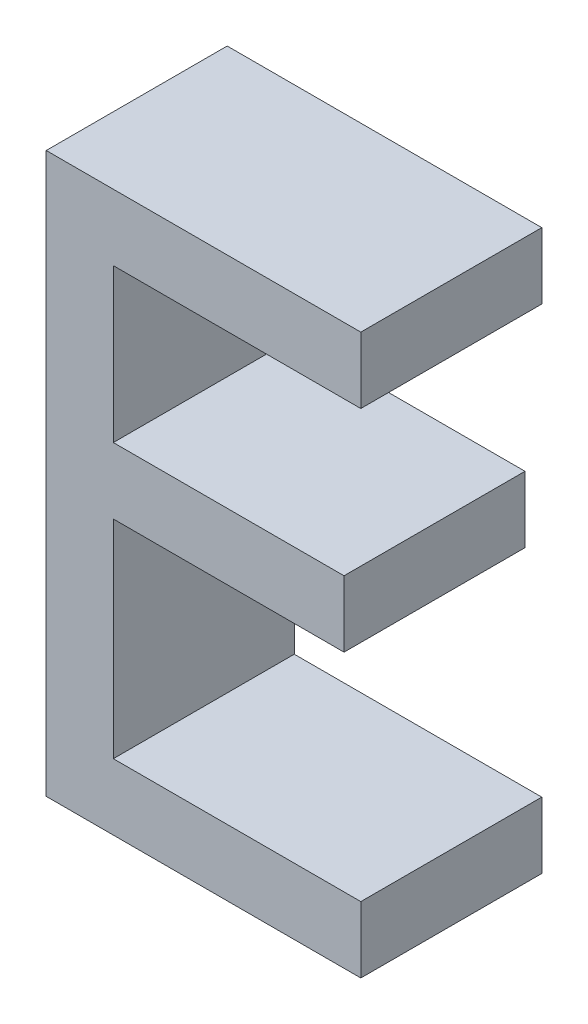
ISO-10303-21;
HEADER;
FILE_DESCRIPTION(('STEP AP214'),'2;1');
FILE_NAME('part.step','',(''),(''),'','','');
FILE_SCHEMA(('AUTOMOTIVE_DESIGN { 1 0 10303 214 1 1 1 1 }'));
ENDSEC;
DATA;
#1=APPLICATION_CONTEXT('core data for automotive mechanical design processes');
#2=APPLICATION_PROTOCOL_DEFINITION('international standard','automotive_design',2000,#1);
#3=PRODUCT_CONTEXT('',#1,'mechanical');
#4=PRODUCT('Part','Part','',(#3));
#5=PRODUCT_RELATED_PRODUCT_CATEGORY('part','',(#4));
#6=PRODUCT_DEFINITION_FORMATION('','',#4);
#7=PRODUCT_DEFINITION_CONTEXT('part definition',#1,'design');
#8=PRODUCT_DEFINITION('design','',#6,#7);
#9=PRODUCT_DEFINITION_SHAPE('','',#8);
#10=(LENGTH_UNIT() NAMED_UNIT(*) SI_UNIT(.MILLI.,.METRE.));
#11=(NAMED_UNIT(*) PLANE_ANGLE_UNIT() SI_UNIT($,.RADIAN.));
#12=(NAMED_UNIT(*) SI_UNIT($,.STERADIAN.) SOLID_ANGLE_UNIT());
#13=UNCERTAINTY_MEASURE_WITH_UNIT(LENGTH_MEASURE(1.E-05),#10,'distance_accuracy_value','');
#14=(GEOMETRIC_REPRESENTATION_CONTEXT(3) GLOBAL_UNCERTAINTY_ASSIGNED_CONTEXT((#13)) GLOBAL_UNIT_ASSIGNED_CONTEXT((#10,
#11,#12)) REPRESENTATION_CONTEXT('',''));
#15=CARTESIAN_POINT('',(0.,0.,0.));
#16=DIRECTION('',(0.,0.,1.));
#17=DIRECTION('',(1.,0.,0.));
#18=AXIS2_PLACEMENT_3D('',#15,#16,#17);
#19=CARTESIAN_POINT('',(-2.852208443237,0.498530555112812,0.));
#20=DIRECTION('',(0.,1.,0.));
#21=DIRECTION('',(-1.,0.,0.));
#22=AXIS2_PLACEMENT_3D('',#19,#20,#21);
#23=PLANE('',#22);
#24=DIRECTION('',(1.,0.,0.));
#25=VECTOR('',#24,1.);
#26=CARTESIAN_POINT('',(-3.026047706348,0.498530555112812,0.));
#27=LINE('',#26,#25);
#28=CARTESIAN_POINT('',(-3.026047706348,0.498530555112812,0.));
#29=VERTEX_POINT('',#28);
#30=CARTESIAN_POINT('',(-2.852208443237,0.498530555112812,0.));
#31=VERTEX_POINT('',#30);
#32=EDGE_CURVE('E11',#29,#31,#27,.T.);
#33=ORIENTED_EDGE('',*,*,#32,.F.);
#34=DIRECTION('',(0.,0.,1.));
#35=VECTOR('',#34,1.);
#36=CARTESIAN_POINT('',(-3.026047706348,0.498530555112812,0.));
#37=LINE('',#36,#35);
#38=CARTESIAN_POINT('',(-3.026047706348,0.498530555112812,0.1));
#39=VERTEX_POINT('',#38);
#40=EDGE_CURVE('E24',#29,#39,#37,.T.);
#41=ORIENTED_EDGE('',*,*,#40,.T.);
#42=DIRECTION('',(-1.,0.,0.));
#43=VECTOR('',#42,1.);
#44=CARTESIAN_POINT('',(-3.026047706348,0.498530555112812,0.1));
#45=LINE('',#44,#43);
#46=CARTESIAN_POINT('',(-2.852208443237,0.498530555112812,0.1));
#47=VERTEX_POINT('',#46);
#48=EDGE_CURVE('E124',#47,#39,#45,.T.);
#49=ORIENTED_EDGE('',*,*,#48,.F.);
#50=DIRECTION('',(0.,0.,1.));
#51=VECTOR('',#50,1.);
#52=CARTESIAN_POINT('',(-2.852208443237,0.498530555112812,0.));
#53=LINE('',#52,#51);
#54=EDGE_CURVE('E197',#31,#47,#53,.T.);
#55=ORIENTED_EDGE('',*,*,#54,.F.);
#56=EDGE_LOOP('',(#33,#41,#49,#55));
#57=FACE_BOUND('',#56,.T.);
#58=ADVANCED_FACE('F17',(#57),#23,.T.);
#59=CARTESIAN_POINT('',(-2.852208443237,0.461959182758085,0.));
#60=DIRECTION('',(1.,0.,0.));
#61=DIRECTION('',(0.,1.,0.));
#62=AXIS2_PLACEMENT_3D('',#59,#60,#61);
#63=PLANE('',#62);
#64=DIRECTION('',(0.,-1.,0.));
#65=VECTOR('',#64,1.);
#66=CARTESIAN_POINT('',(-2.852208443237,0.498530555112812,0.));
#67=LINE('',#66,#65);
#68=CARTESIAN_POINT('',(-2.852208443237,0.461959182758085,0.));
#69=VERTEX_POINT('',#68);
#70=EDGE_CURVE('E195',#31,#69,#67,.T.);
#71=ORIENTED_EDGE('',*,*,#70,.F.);
#72=ORIENTED_EDGE('',*,*,#54,.T.);
#73=DIRECTION('',(0.,1.,0.));
#74=VECTOR('',#73,1.);
#75=CARTESIAN_POINT('',(-2.852208443237,0.498530555112812,0.1));
#76=LINE('',#75,#74);
#77=CARTESIAN_POINT('',(-2.852208443237,0.461959182758085,0.1));
#78=VERTEX_POINT('',#77);
#79=EDGE_CURVE('E193',#78,#47,#76,.T.);
#80=ORIENTED_EDGE('',*,*,#79,.F.);
#81=DIRECTION('',(0.,0.,1.));
#82=VECTOR('',#81,1.);
#83=CARTESIAN_POINT('',(-2.852208443237,0.461959182758085,0.));
#84=LINE('',#83,#82);
#85=EDGE_CURVE('E190',#69,#78,#84,.T.);
#86=ORIENTED_EDGE('',*,*,#85,.F.);
#87=EDGE_LOOP('',(#71,#72,#80,#86));
#88=FACE_BOUND('',#87,.T.);
#89=ADVANCED_FACE('F235',(#88),#63,.T.);
#90=CARTESIAN_POINT('',(-2.98897535629,0.461959182758085,0.));
#91=DIRECTION('',(0.,-1.,0.));
#92=DIRECTION('',(1.,0.,0.));
#93=AXIS2_PLACEMENT_3D('',#90,#91,#92);
#94=PLANE('',#93);
#95=DIRECTION('',(-1.,0.,0.));
#96=VECTOR('',#95,1.);
#97=CARTESIAN_POINT('',(-2.852208443237,0.461959182758085,0.));
#98=LINE('',#97,#96);
#99=CARTESIAN_POINT('',(-2.98897535629,0.461959182758085,0.));
#100=VERTEX_POINT('',#99);
#101=EDGE_CURVE('E188',#69,#100,#98,.T.);
#102=ORIENTED_EDGE('',*,*,#101,.F.);
#103=ORIENTED_EDGE('',*,*,#85,.T.);
#104=DIRECTION('',(1.,0.,0.));
#105=VECTOR('',#104,1.);
#106=CARTESIAN_POINT('',(-2.852208443237,0.461959182758085,0.1));
#107=LINE('',#106,#105);
#108=CARTESIAN_POINT('',(-2.98897535629,0.461959182758085,0.1));
#109=VERTEX_POINT('',#108);
#110=EDGE_CURVE('E185',#109,#78,#107,.T.);
#111=ORIENTED_EDGE('',*,*,#110,.F.);
#112=DIRECTION('',(0.,0.,1.));
#113=VECTOR('',#112,1.);
#114=CARTESIAN_POINT('',(-2.98897535629,0.461959182758085,0.));
#115=LINE('',#114,#113);
#116=EDGE_CURVE('E182',#100,#109,#115,.T.);
#117=ORIENTED_EDGE('',*,*,#116,.F.);
#118=EDGE_LOOP('',(#102,#103,#111,#117));
#119=FACE_BOUND('',#118,.T.);
#120=ADVANCED_FACE('F231',(#119),#94,.T.);
#121=CARTESIAN_POINT('',(-2.98897535629,0.377293950868377,0.));
#122=DIRECTION('',(1.,0.,0.));
#123=DIRECTION('',(0.,1.,0.));
#124=AXIS2_PLACEMENT_3D('',#121,#122,#123);
#125=PLANE('',#124);
#126=DIRECTION('',(0.,-1.,0.));
#127=VECTOR('',#126,1.);
#128=CARTESIAN_POINT('',(-2.98897535629,0.461959182758085,0.));
#129=LINE('',#128,#127);
#130=CARTESIAN_POINT('',(-2.98897535629,0.377293950868377,0.));
#131=VERTEX_POINT('',#130);
#132=EDGE_CURVE('E180',#100,#131,#129,.T.);
#133=ORIENTED_EDGE('',*,*,#132,.F.);
#134=ORIENTED_EDGE('',*,*,#116,.T.);
#135=DIRECTION('',(0.,1.,0.));
#136=VECTOR('',#135,1.);
#137=CARTESIAN_POINT('',(-2.98897535629,0.461959182758085,0.1));
#138=LINE('',#137,#136);
#139=CARTESIAN_POINT('',(-2.98897535629,0.377293950868377,0.1));
#140=VERTEX_POINT('',#139);
#141=EDGE_CURVE('E177',#140,#109,#138,.T.);
#142=ORIENTED_EDGE('',*,*,#141,.F.);
#143=DIRECTION('',(0.,0.,1.));
#144=VECTOR('',#143,1.);
#145=CARTESIAN_POINT('',(-2.98897535629,0.377293950868377,0.));
#146=LINE('',#145,#144);
#147=EDGE_CURVE('E174',#131,#140,#146,.T.);
#148=ORIENTED_EDGE('',*,*,#147,.F.);
#149=EDGE_LOOP('',(#133,#134,#142,#148));
#150=FACE_BOUND('',#149,.T.);
#151=ADVANCED_FACE('F227',(#150),#125,.T.);
#152=CARTESIAN_POINT('',(-2.861476530752,0.377293950868377,0.));
#153=DIRECTION('',(0.,1.,0.));
#154=DIRECTION('',(-1.,0.,0.));
#155=AXIS2_PLACEMENT_3D('',#152,#153,#154);
#156=PLANE('',#155);
#157=DIRECTION('',(1.,0.,0.));
#158=VECTOR('',#157,1.);
#159=CARTESIAN_POINT('',(-2.98897535629,0.377293950868377,0.));
#160=LINE('',#159,#158);
#161=CARTESIAN_POINT('',(-2.861476530752,0.377293950868377,0.));
#162=VERTEX_POINT('',#161);
#163=EDGE_CURVE('E172',#131,#162,#160,.T.);
#164=ORIENTED_EDGE('',*,*,#163,.F.);
#165=ORIENTED_EDGE('',*,*,#147,.T.);
#166=DIRECTION('',(-1.,0.,0.));
#167=VECTOR('',#166,1.);
#168=CARTESIAN_POINT('',(-2.98897535629,0.377293950868377,0.1));
#169=LINE('',#168,#167);
#170=CARTESIAN_POINT('',(-2.861476530752,0.377293950868377,0.1));
#171=VERTEX_POINT('',#170);
#172=EDGE_CURVE('E169',#171,#140,#169,.T.);
#173=ORIENTED_EDGE('',*,*,#172,.F.);
#174=DIRECTION('',(0.,0.,1.));
#175=VECTOR('',#174,1.);
#176=CARTESIAN_POINT('',(-2.861476530752,0.377293950868377,0.));
#177=LINE('',#176,#175);
#178=EDGE_CURVE('E166',#162,#171,#177,.T.);
#179=ORIENTED_EDGE('',*,*,#178,.F.);
#180=EDGE_LOOP('',(#164,#165,#173,#179));
#181=FACE_BOUND('',#180,.T.);
#182=ADVANCED_FACE('F223',(#181),#156,.T.);
#183=CARTESIAN_POINT('',(-2.861476530752,0.340722578513651,0.));
#184=DIRECTION('',(1.,0.,0.));
#185=DIRECTION('',(0.,1.,0.));
#186=AXIS2_PLACEMENT_3D('',#183,#184,#185);
#187=PLANE('',#186);
#188=DIRECTION('',(0.,-1.,0.));
#189=VECTOR('',#188,1.);
#190=CARTESIAN_POINT('',(-2.861476530752,0.377293950868377,0.));
#191=LINE('',#190,#189);
#192=CARTESIAN_POINT('',(-2.861476530752,0.340722578513651,0.));
#193=VERTEX_POINT('',#192);
#194=EDGE_CURVE('E164',#162,#193,#191,.T.);
#195=ORIENTED_EDGE('',*,*,#194,.F.);
#196=ORIENTED_EDGE('',*,*,#178,.T.);
#197=DIRECTION('',(0.,1.,0.));
#198=VECTOR('',#197,1.);
#199=CARTESIAN_POINT('',(-2.861476530752,0.377293950868377,0.1));
#200=LINE('',#199,#198);
#201=CARTESIAN_POINT('',(-2.861476530752,0.340722578513651,0.1));
#202=VERTEX_POINT('',#201);
#203=EDGE_CURVE('E161',#202,#171,#200,.T.);
#204=ORIENTED_EDGE('',*,*,#203,.F.);
#205=DIRECTION('',(0.,0.,1.));
#206=VECTOR('',#205,1.);
#207=CARTESIAN_POINT('',(-2.861476530752,0.340722578513651,0.));
#208=LINE('',#207,#206);
#209=EDGE_CURVE('E158',#193,#202,#208,.T.);
#210=ORIENTED_EDGE('',*,*,#209,.F.);
#211=EDGE_LOOP('',(#195,#196,#204,#210));
#212=FACE_BOUND('',#211,.T.);
#213=ADVANCED_FACE('F219',(#212),#187,.T.);
#214=CARTESIAN_POINT('',(-2.98897535629,0.340722578513651,0.));
#215=DIRECTION('',(0.,-1.,0.));
#216=DIRECTION('',(1.,0.,0.));
#217=AXIS2_PLACEMENT_3D('',#214,#215,#216);
#218=PLANE('',#217);
#219=DIRECTION('',(-1.,0.,0.));
#220=VECTOR('',#219,1.);
#221=CARTESIAN_POINT('',(-2.861476530752,0.340722578513651,0.));
#222=LINE('',#221,#220);
#223=CARTESIAN_POINT('',(-2.98897535629,0.340722578513651,0.));
#224=VERTEX_POINT('',#223);
#225=EDGE_CURVE('E156',#193,#224,#222,.T.);
#226=ORIENTED_EDGE('',*,*,#225,.F.);
#227=ORIENTED_EDGE('',*,*,#209,.T.);
#228=DIRECTION('',(1.,0.,0.));
#229=VECTOR('',#228,1.);
#230=CARTESIAN_POINT('',(-2.861476530752,0.340722578513651,0.1));
#231=LINE('',#230,#229);
#232=CARTESIAN_POINT('',(-2.98897535629,0.340722578513651,0.1));
#233=VERTEX_POINT('',#232);
#234=EDGE_CURVE('E153',#233,#202,#231,.T.);
#235=ORIENTED_EDGE('',*,*,#234,.F.);
#236=DIRECTION('',(0.,0.,1.));
#237=VECTOR('',#236,1.);
#238=CARTESIAN_POINT('',(-2.98897535629,0.340722578513651,0.));
#239=LINE('',#238,#237);
#240=EDGE_CURVE('E150',#224,#233,#239,.T.);
#241=ORIENTED_EDGE('',*,*,#240,.F.);
#242=EDGE_LOOP('',(#226,#227,#235,#241));
#243=FACE_BOUND('',#242,.T.);
#244=ADVANCED_FACE('F215',(#243),#218,.T.);
#245=CARTESIAN_POINT('',(-2.98897535629,0.225998684414578,0.));
#246=DIRECTION('',(1.,0.,0.));
#247=DIRECTION('',(0.,1.,0.));
#248=AXIS2_PLACEMENT_3D('',#245,#246,#247);
#249=PLANE('',#248);
#250=DIRECTION('',(0.,-1.,0.));
#251=VECTOR('',#250,1.);
#252=CARTESIAN_POINT('',(-2.98897535629,0.340722578513651,0.));
#253=LINE('',#252,#251);
#254=CARTESIAN_POINT('',(-2.98897535629,0.225998684414578,0.));
#255=VERTEX_POINT('',#254);
#256=EDGE_CURVE('E148',#224,#255,#253,.T.);
#257=ORIENTED_EDGE('',*,*,#256,.F.);
#258=ORIENTED_EDGE('',*,*,#240,.T.);
#259=DIRECTION('',(0.,1.,0.));
#260=VECTOR('',#259,1.);
#261=CARTESIAN_POINT('',(-2.98897535629,0.340722578513651,0.1));
#262=LINE('',#261,#260);
#263=CARTESIAN_POINT('',(-2.98897535629,0.225998684414578,0.1));
#264=VERTEX_POINT('',#263);
#265=EDGE_CURVE('E145',#264,#233,#262,.T.);
#266=ORIENTED_EDGE('',*,*,#265,.F.);
#267=DIRECTION('',(0.,0.,1.));
#268=VECTOR('',#267,1.);
#269=CARTESIAN_POINT('',(-2.98897535629,0.225998684414578,0.));
#270=LINE('',#269,#268);
#271=EDGE_CURVE('E142',#255,#264,#270,.T.);
#272=ORIENTED_EDGE('',*,*,#271,.F.);
#273=EDGE_LOOP('',(#257,#258,#266,#272));
#274=FACE_BOUND('',#273,.T.);
#275=ADVANCED_FACE('F211',(#274),#249,.T.);
#276=CARTESIAN_POINT('',(-2.852208443237,0.225998684414578,0.));
#277=DIRECTION('',(0.,1.,0.));
#278=DIRECTION('',(-1.,0.,0.));
#279=AXIS2_PLACEMENT_3D('',#276,#277,#278);
#280=PLANE('',#279);
#281=DIRECTION('',(1.,0.,0.));
#282=VECTOR('',#281,1.);
#283=CARTESIAN_POINT('',(-2.98897535629,0.225998684414578,0.));
#284=LINE('',#283,#282);
#285=CARTESIAN_POINT('',(-2.852208443237,0.225998684414578,0.));
#286=VERTEX_POINT('',#285);
#287=EDGE_CURVE('E140',#255,#286,#284,.T.);
#288=ORIENTED_EDGE('',*,*,#287,.F.);
#289=ORIENTED_EDGE('',*,*,#271,.T.);
#290=DIRECTION('',(-1.,0.,0.));
#291=VECTOR('',#290,1.);
#292=CARTESIAN_POINT('',(-2.98897535629,0.225998684414578,0.1));
#293=LINE('',#292,#291);
#294=CARTESIAN_POINT('',(-2.852208443237,0.225998684414578,0.1));
#295=VERTEX_POINT('',#294);
#296=EDGE_CURVE('E137',#295,#264,#293,.T.);
#297=ORIENTED_EDGE('',*,*,#296,.F.);
#298=DIRECTION('',(0.,0.,1.));
#299=VECTOR('',#298,1.);
#300=CARTESIAN_POINT('',(-2.852208443237,0.225998684414578,0.));
#301=LINE('',#300,#299);
#302=EDGE_CURVE('E134',#286,#295,#301,.T.);
#303=ORIENTED_EDGE('',*,*,#302,.F.);
#304=EDGE_LOOP('',(#288,#289,#297,#303));
#305=FACE_BOUND('',#304,.T.);
#306=ADVANCED_FACE('F207',(#305),#280,.T.);
#307=CARTESIAN_POINT('',(-2.852208443237,0.189427312059852,0.));
#308=DIRECTION('',(1.,0.,0.));
#309=DIRECTION('',(0.,1.,0.));
#310=AXIS2_PLACEMENT_3D('',#307,#308,#309);
#311=PLANE('',#310);
#312=DIRECTION('',(0.,-1.,0.));
#313=VECTOR('',#312,1.);
#314=CARTESIAN_POINT('',(-2.852208443237,0.225998684414578,0.));
#315=LINE('',#314,#313);
#316=CARTESIAN_POINT('',(-2.852208443237,0.189427312059852,0.));
#317=VERTEX_POINT('',#316);
#318=EDGE_CURVE('E132',#286,#317,#315,.T.);
#319=ORIENTED_EDGE('',*,*,#318,.F.);
#320=ORIENTED_EDGE('',*,*,#302,.T.);
#321=DIRECTION('',(0.,1.,0.));
#322=VECTOR('',#321,1.);
#323=CARTESIAN_POINT('',(-2.852208443237,0.225998684414578,0.1));
#324=LINE('',#323,#322);
#325=CARTESIAN_POINT('',(-2.852208443237,0.189427312059852,0.1));
#326=VERTEX_POINT('',#325);
#327=EDGE_CURVE('E130',#326,#295,#324,.T.);
#328=ORIENTED_EDGE('',*,*,#327,.F.);
#329=DIRECTION('',(0.,0.,1.));
#330=VECTOR('',#329,1.);
#331=CARTESIAN_POINT('',(-2.852208443237,0.189427312059852,0.));
#332=LINE('',#331,#330);
#333=EDGE_CURVE('E109',#317,#326,#332,.T.);
#334=ORIENTED_EDGE('',*,*,#333,.F.);
#335=EDGE_LOOP('',(#319,#320,#328,#334));
#336=FACE_BOUND('',#335,.T.);
#337=ADVANCED_FACE('F205',(#336),#311,.T.);
#338=CARTESIAN_POINT('',(-3.026047706348,0.189427312059852,0.));
#339=DIRECTION('',(0.,-1.,0.));
#340=DIRECTION('',(1.,0.,0.));
#341=AXIS2_PLACEMENT_3D('',#338,#339,#340);
#342=PLANE('',#341);
#343=DIRECTION('',(-1.,0.,0.));
#344=VECTOR('',#343,1.);
#345=CARTESIAN_POINT('',(-2.852208443237,0.189427312059852,0.));
#346=LINE('',#345,#344);
#347=CARTESIAN_POINT('',(-3.026047706348,0.189427312059852,0.));
#348=VERTEX_POINT('',#347);
#349=EDGE_CURVE('E113',#317,#348,#346,.T.);
#350=ORIENTED_EDGE('',*,*,#349,.F.);
#351=ORIENTED_EDGE('',*,*,#333,.T.);
#352=DIRECTION('',(1.,0.,0.));
#353=VECTOR('',#352,1.);
#354=CARTESIAN_POINT('',(-2.852208443237,0.189427312059852,0.1));
#355=LINE('',#354,#353);
#356=CARTESIAN_POINT('',(-3.026047706348,0.189427312059852,0.1));
#357=VERTEX_POINT('',#356);
#358=EDGE_CURVE('E102',#357,#326,#355,.T.);
#359=ORIENTED_EDGE('',*,*,#358,.F.);
#360=DIRECTION('',(0.,0.,1.));
#361=VECTOR('',#360,1.);
#362=CARTESIAN_POINT('',(-3.026047706348,0.189427312059852,0.));
#363=LINE('',#362,#361);
#364=EDGE_CURVE('E106',#348,#357,#363,.T.);
#365=ORIENTED_EDGE('',*,*,#364,.F.);
#366=EDGE_LOOP('',(#350,#351,#359,#365));
#367=FACE_BOUND('',#366,.T.);
#368=ADVANCED_FACE('F105',(#367),#342,.T.);
#369=CARTESIAN_POINT('',(-3.026047706348,0.498530555112812,0.));
#370=DIRECTION('',(-1.,0.,0.));
#371=DIRECTION('',(0.,-1.,0.));
#372=AXIS2_PLACEMENT_3D('',#369,#370,#371);
#373=PLANE('',#372);
#374=DIRECTION('',(0.,1.,0.));
#375=VECTOR('',#374,1.);
#376=CARTESIAN_POINT('',(-3.026047706348,0.189427312059852,0.));
#377=LINE('',#376,#375);
#378=EDGE_CURVE('E119',#348,#29,#377,.T.);
#379=ORIENTED_EDGE('',*,*,#378,.F.);
#380=ORIENTED_EDGE('',*,*,#364,.T.);
#381=DIRECTION('',(0.,-1.,0.));
#382=VECTOR('',#381,1.);
#383=CARTESIAN_POINT('',(-3.026047706348,0.189427312059852,0.1));
#384=LINE('',#383,#382);
#385=EDGE_CURVE('E118',#39,#357,#384,.T.);
#386=ORIENTED_EDGE('',*,*,#385,.F.);
#387=ORIENTED_EDGE('',*,*,#40,.F.);
#388=EDGE_LOOP('',(#379,#380,#386,#387));
#389=FACE_BOUND('',#388,.T.);
#390=ADVANCED_FACE('F117',(#389),#373,.T.);
#391=CARTESIAN_POINT('',(-2.951837717904,0.346543442313212,0.));
#392=DIRECTION('',(0.,0.,1.));
#393=DIRECTION('',(1.,0.,0.));
#394=AXIS2_PLACEMENT_3D('',#391,#392,#393);
#395=PLANE('',#394);
#396=ORIENTED_EDGE('',*,*,#378,.T.);
#397=ORIENTED_EDGE('',*,*,#32,.T.);
#398=ORIENTED_EDGE('',*,*,#70,.T.);
#399=ORIENTED_EDGE('',*,*,#101,.T.);
#400=ORIENTED_EDGE('',*,*,#132,.T.);
#401=ORIENTED_EDGE('',*,*,#163,.T.);
#402=ORIENTED_EDGE('',*,*,#194,.T.);
#403=ORIENTED_EDGE('',*,*,#225,.T.);
#404=ORIENTED_EDGE('',*,*,#256,.T.);
#405=ORIENTED_EDGE('',*,*,#287,.T.);
#406=ORIENTED_EDGE('',*,*,#318,.T.);
#407=ORIENTED_EDGE('',*,*,#349,.T.);
#408=EDGE_LOOP('',(#396,#397,#398,#399,#400,#401,#402,#403,#404,#405,#406,#407));
#409=FACE_BOUND('',#408,.T.);
#410=ADVANCED_FACE('F200',(#409),#395,.F.);
#411=CARTESIAN_POINT('',(-2.951837717904,0.346543442313212,0.1));
#412=DIRECTION('',(0.,0.,1.));
#413=DIRECTION('',(1.,0.,0.));
#414=AXIS2_PLACEMENT_3D('',#411,#412,#413);
#415=PLANE('',#414);
#416=ORIENTED_EDGE('',*,*,#385,.T.);
#417=ORIENTED_EDGE('',*,*,#358,.T.);
#418=ORIENTED_EDGE('',*,*,#327,.T.);
#419=ORIENTED_EDGE('',*,*,#296,.T.);
#420=ORIENTED_EDGE('',*,*,#265,.T.);
#421=ORIENTED_EDGE('',*,*,#234,.T.);
#422=ORIENTED_EDGE('',*,*,#203,.T.);
#423=ORIENTED_EDGE('',*,*,#172,.T.);
#424=ORIENTED_EDGE('',*,*,#141,.T.);
#425=ORIENTED_EDGE('',*,*,#110,.T.);
#426=ORIENTED_EDGE('',*,*,#79,.T.);
#427=ORIENTED_EDGE('',*,*,#48,.T.);
#428=EDGE_LOOP('',(#416,#417,#418,#419,#420,#421,#422,#423,#424,#425,#426,#427));
#429=FACE_BOUND('',#428,.T.);
#430=ADVANCED_FACE('F122',(#429),#415,.T.);
#431=CLOSED_SHELL('',(#58,#89,#120,#151,#182,#213,#244,#275,#306,#337,#368,#390,#410,#430));
#432=MANIFOLD_SOLID_BREP('B1',#431);
#433=ADVANCED_BREP_SHAPE_REPRESENTATION('',(#18,#432),#14);
#434=SHAPE_DEFINITION_REPRESENTATION(#9,#433);
ENDSEC;
END-ISO-10303-21;
